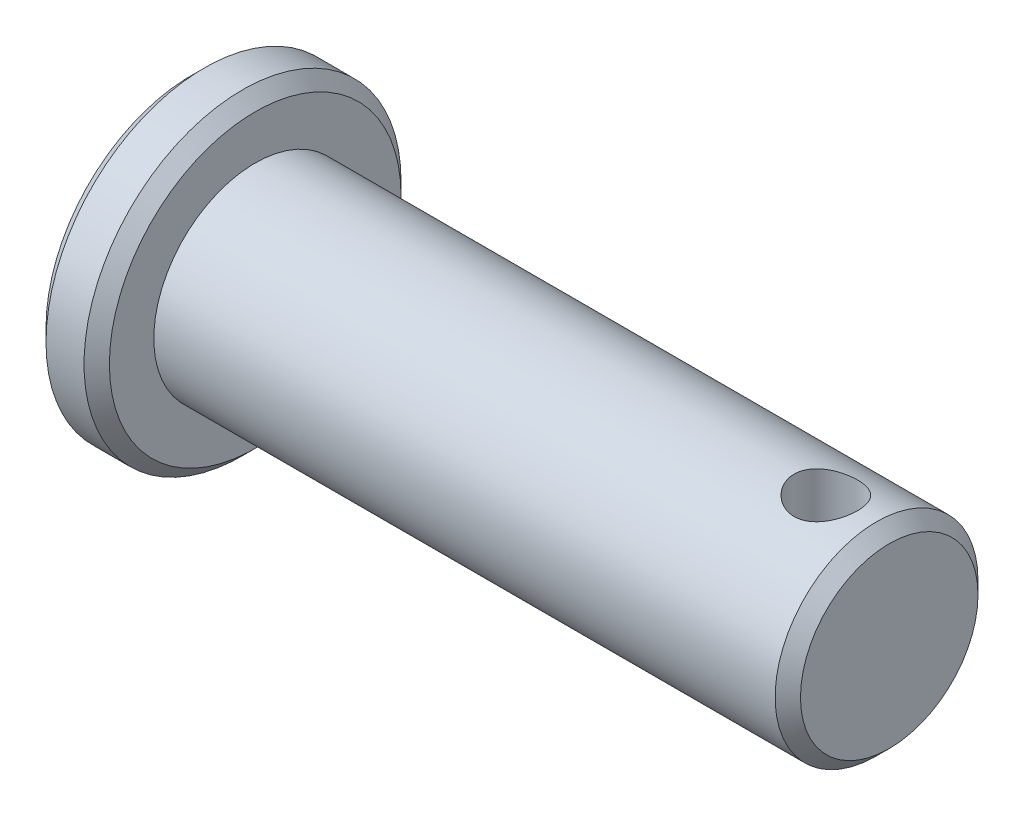
ISO-10303-21;
HEADER;
FILE_DESCRIPTION(('STEP AP214'),'2;1');
FILE_NAME('part.step','',(''),(''),'','','');
FILE_SCHEMA(('AUTOMOTIVE_DESIGN { 1 0 10303 214 1 1 1 1 }'));
ENDSEC;
DATA;
#1=APPLICATION_CONTEXT('core data for automotive mechanical design processes');
#2=APPLICATION_PROTOCOL_DEFINITION('international standard','automotive_design',2000,#1);
#3=PRODUCT_CONTEXT('',#1,'mechanical');
#4=PRODUCT('Part','Part','',(#3));
#5=PRODUCT_RELATED_PRODUCT_CATEGORY('part','',(#4));
#6=PRODUCT_DEFINITION_FORMATION('','',#4);
#7=PRODUCT_DEFINITION_CONTEXT('part definition',#1,'design');
#8=PRODUCT_DEFINITION('design','',#6,#7);
#9=PRODUCT_DEFINITION_SHAPE('','',#8);
#10=(LENGTH_UNIT() NAMED_UNIT(*) SI_UNIT(.MILLI.,.METRE.));
#11=(NAMED_UNIT(*) PLANE_ANGLE_UNIT() SI_UNIT($,.RADIAN.));
#12=(NAMED_UNIT(*) SI_UNIT($,.STERADIAN.) SOLID_ANGLE_UNIT());
#13=UNCERTAINTY_MEASURE_WITH_UNIT(LENGTH_MEASURE(1.E-05),#10,'distance_accuracy_value','');
#14=(GEOMETRIC_REPRESENTATION_CONTEXT(3) GLOBAL_UNCERTAINTY_ASSIGNED_CONTEXT((#13)) GLOBAL_UNIT_ASSIGNED_CONTEXT((#10,
#11,#12)) REPRESENTATION_CONTEXT('',''));
#15=CARTESIAN_POINT('',(0.,0.,0.));
#16=DIRECTION('',(0.,0.,1.));
#17=DIRECTION('',(1.,0.,0.));
#18=AXIS2_PLACEMENT_3D('',#15,#16,#17);
#19=CARTESIAN_POINT('',(-55.,0.,0.));
#20=DIRECTION('',(-1.,0.,0.));
#21=DIRECTION('',(0.,0.,1.));
#22=AXIS2_PLACEMENT_3D('',#19,#20,#21);
#23=PLANE('',#22);
#24=CARTESIAN_POINT('',(-55.,0.,0.));
#25=DIRECTION('',(-1.,0.,0.));
#26=DIRECTION('',(0.,0.,1.));
#27=AXIS2_PLACEMENT_3D('',#24,#25,#26);
#28=CIRCLE('',#27,11.5);
#29=CARTESIAN_POINT('',(-55.,0.,11.5));
#30=VERTEX_POINT('',#29);
#31=EDGE_CURVE('E50',#30,#30,#28,.T.);
#32=ORIENTED_EDGE('',*,*,#31,.T.);
#33=EDGE_LOOP('',(#32));
#34=FACE_BOUND('',#33,.T.);
#35=ADVANCED_FACE('F32',(#34),#23,.T.);
#36=CARTESIAN_POINT('',(0.,0.,0.));
#37=DIRECTION('',(1.,0.,0.));
#38=DIRECTION('',(0.,0.,-1.));
#39=AXIS2_PLACEMENT_3D('',#36,#37,#38);
#40=CYLINDRICAL_SURFACE('',#39,12.5);
#41=CARTESIAN_POINT('',(-51.,0.,0.));
#42=DIRECTION('',(1.,0.,0.));
#43=DIRECTION('',(0.,0.,-1.));
#44=AXIS2_PLACEMENT_3D('',#41,#42,#43);
#45=CIRCLE('',#44,12.5);
#46=CARTESIAN_POINT('',(-51.,0.,-12.5));
#47=VERTEX_POINT('',#46);
#48=EDGE_CURVE('E102',#47,#47,#45,.F.);
#49=ORIENTED_EDGE('',*,*,#48,.T.);
#50=EDGE_LOOP('',(#49));
#51=FACE_BOUND('',#50,.T.);
#52=CARTESIAN_POINT('',(-54.,0.,0.));
#53=DIRECTION('',(-1.,0.,0.));
#54=DIRECTION('',(0.,0.,1.));
#55=AXIS2_PLACEMENT_3D('',#52,#53,#54);
#56=CIRCLE('',#55,12.5);
#57=CARTESIAN_POINT('',(-54.,0.,12.5));
#58=VERTEX_POINT('',#57);
#59=EDGE_CURVE('E100',#58,#58,#56,.F.);
#60=ORIENTED_EDGE('',*,*,#59,.T.);
#61=EDGE_LOOP('',(#60));
#62=FACE_BOUND('',#61,.T.);
#63=ADVANCED_FACE('F81',(#51,#62),#40,.T.);
#64=CARTESIAN_POINT('',(-50.,12.5,0.));
#65=DIRECTION('',(1.,0.,0.));
#66=DIRECTION('',(0.,0.,-1.));
#67=AXIS2_PLACEMENT_3D('',#64,#65,#66);
#68=PLANE('',#67);
#69=CARTESIAN_POINT('',(-50.,0.,0.));
#70=DIRECTION('',(1.,0.,0.));
#71=DIRECTION('',(0.,0.,-1.));
#72=AXIS2_PLACEMENT_3D('',#69,#70,#71);
#73=CIRCLE('',#72,11.5);
#74=CARTESIAN_POINT('',(-50.,0.,-11.5));
#75=VERTEX_POINT('',#74);
#76=EDGE_CURVE('E103',#75,#75,#73,.T.);
#77=ORIENTED_EDGE('',*,*,#76,.T.);
#78=EDGE_LOOP('',(#77));
#79=FACE_BOUND('',#78,.T.);
#80=CARTESIAN_POINT('',(-50.,0.,0.));
#81=DIRECTION('',(1.,0.,0.));
#82=DIRECTION('',(0.,0.,-1.));
#83=AXIS2_PLACEMENT_3D('',#80,#81,#82);
#84=CIRCLE('',#83,7.99999999999999);
#85=CARTESIAN_POINT('',(-50.,0.,-7.99999999999999));
#86=VERTEX_POINT('',#85);
#87=EDGE_CURVE('E108',#86,#86,#84,.T.);
#88=ORIENTED_EDGE('',*,*,#87,.F.);
#89=EDGE_LOOP('',(#88));
#90=FACE_BOUND('',#89,.T.);
#91=ADVANCED_FACE('F78',(#79,#90),#68,.T.);
#92=CARTESIAN_POINT('',(0.,0.,0.));
#93=DIRECTION('',(1.,0.,0.));
#94=DIRECTION('',(0.,0.,-1.));
#95=AXIS2_PLACEMENT_3D('',#92,#93,#94);
#96=CYLINDRICAL_SURFACE('',#95,7.99999999999999);
#97=CARTESIAN_POINT('',(-5.,-7.59934207678532,2.5));
#98=CARTESIAN_POINT('',(-5.13669407221868,-7.59934291923871,2.49999907560094));
#99=CARTESIAN_POINT('',(-5.2733975374064,-7.60307063010084,2.48875077582989));
#100=CARTESIAN_POINT('',(-5.54278832175562,-7.61751277997753,2.44418350802654));
#101=CARTESIAN_POINT('',(-5.67547454546433,-7.62822910706271,2.4108585756503));
#102=CARTESIAN_POINT('',(-5.932889803864,-7.65531877671918,2.32339576447118));
#103=CARTESIAN_POINT('',(-6.05763246621136,-7.67168210388632,2.26929471473354));
#104=CARTESIAN_POINT('',(-6.29630539172803,-7.70820812437376,2.14193828346314));
#105=CARTESIAN_POINT('',(-6.41023373992025,-7.7283714887168,2.06867951811264));
#106=CARTESIAN_POINT('',(-6.62795773498698,-7.77100255337239,1.90239214124459));
#107=CARTESIAN_POINT('',(-6.73132721887198,-7.79352246769559,1.8088187994408));
#108=CARTESIAN_POINT('',(-6.92119202641838,-7.8378849172067,1.60572409291099));
#109=CARTESIAN_POINT('',(-7.0076849938897,-7.85972735745254,1.49620050503713));
#110=CARTESIAN_POINT('',(-7.16322212602249,-7.90087106780156,1.26125182498672));
#111=CARTESIAN_POINT('',(-7.23182740766292,-7.92010369125559,1.13552311304019));
#112=CARTESIAN_POINT('',(-7.3467520997111,-7.95325103666036,0.873608465706807));
#113=CARTESIAN_POINT('',(-7.39307674829918,-7.96716700839838,0.737424996974103));
#114=CARTESIAN_POINT('',(-7.46070225619414,-7.98774351641723,0.462928713932196));
#115=CARTESIAN_POINT('',(-7.48273149957571,-7.99461477968282,0.324811430936432));
#116=CARTESIAN_POINT('',(-7.50344869287505,-8.00107191752032,0.0466816279690388));
#117=CARTESIAN_POINT('',(-7.50214194871765,-8.0006594482014,-0.093330453946173));
#118=CARTESIAN_POINT('',(-7.47670341682812,-7.99274232265062,-0.366148960709463));
#119=CARTESIAN_POINT('',(-7.453361232974,-7.98548301944273,-0.499037268628066));
#120=CARTESIAN_POINT('',(-7.38581001991397,-7.96498965121749,-0.758906126695562));
#121=CARTESIAN_POINT('',(-7.34159962982675,-7.95175519654418,-0.885886290962472));
#122=CARTESIAN_POINT('',(-7.23305962185038,-7.92046919458912,-1.13215620630948));
#123=CARTESIAN_POINT('',(-7.1684903828745,-7.9023606723334,-1.25133281124536));
#124=CARTESIAN_POINT('',(-7.02125780059033,-7.86323445907696,-1.47740502230437));
#125=CARTESIAN_POINT('',(-6.93858988172226,-7.84221603291308,-1.58429751241882));
#126=CARTESIAN_POINT('',(-6.75345273039958,-7.79847341467062,-1.78747539690657));
#127=CARTESIAN_POINT('',(-6.65030186232582,-7.77571463969685,-1.88313309818382));
#128=CARTESIAN_POINT('',(-6.42920979634287,-7.73181230889307,-2.05597948519529));
#129=CARTESIAN_POINT('',(-6.3112668588193,-7.71066894351395,-2.13316599552377));
#130=CARTESIAN_POINT('',(-6.06216506230486,-7.67221693265788,-2.26760930038169));
#131=CARTESIAN_POINT('',(-5.93087318201806,-7.65495380588193,-2.32463361399527));
#132=CARTESIAN_POINT('',(-5.65988101631599,-7.62675090557698,-2.41556691891091));
#133=CARTESIAN_POINT('',(-5.52018377161125,-7.61580886035022,-2.44948421530003));
#134=CARTESIAN_POINT('',(-5.24236009484572,-7.60199126814081,-2.4920297037281));
#135=CARTESIAN_POINT('',(-5.10439600752974,-7.59880932787511,-2.50161908707794));
#136=CARTESIAN_POINT('',(-4.82882051700973,-7.60002154919848,-2.49793488996242));
#137=CARTESIAN_POINT('',(-4.69120906260067,-7.60441454014632,-2.48466484222813));
#138=CARTESIAN_POINT('',(-4.42438340669516,-7.61997914967832,-2.43649747026382));
#139=CARTESIAN_POINT('',(-4.2950414518516,-7.63095108204021,-2.40223662321101));
#140=CARTESIAN_POINT('',(-4.04395641600833,-7.65822574662761,-2.31380747322029));
#141=CARTESIAN_POINT('',(-3.92221457815774,-7.67452934824622,-2.25963592342302));
#142=CARTESIAN_POINT('',(-3.68592178045639,-7.71121079306467,-2.13115021311757));
#143=CARTESIAN_POINT('',(-3.57167716881442,-7.73169206979508,-2.05630294977117));
#144=CARTESIAN_POINT('',(-3.3570193072762,-7.77420697945614,-1.8892128173596));
#145=CARTESIAN_POINT('',(-3.25660966214934,-7.79624101471393,-1.79696542938156));
#146=CARTESIAN_POINT('',(-3.06817926817436,-7.8404837512537,-1.59314589550721));
#147=CARTESIAN_POINT('',(-2.98084442772027,-7.86266184571361,-1.48093129957704));
#148=CARTESIAN_POINT('',(-2.82621791335749,-7.90378119687352,-1.24290309130279));
#149=CARTESIAN_POINT('',(-2.75892532137793,-7.9227226018189,-1.11709010221724));
#150=CARTESIAN_POINT('',(-2.64693887505664,-7.95512623857024,-0.856211046663662));
#151=CARTESIAN_POINT('',(-2.60208142431264,-7.96862799122399,-0.72122036856751));
#152=CARTESIAN_POINT('',(-2.53585492282059,-7.98880485297151,-0.445114508112778));
#153=CARTESIAN_POINT('',(-2.51447852183301,-7.99548209828554,-0.304001256680712));
#154=CARTESIAN_POINT('',(-2.49641799650076,-8.00111606808922,-0.0259698732977972));
#155=CARTESIAN_POINT('',(-2.49874309965849,-8.00038258814778,0.110878383893045));
#156=CARTESIAN_POINT('',(-2.5256236220974,-7.99201956162096,0.382146443846496));
#157=CARTESIAN_POINT('',(-2.5501775919839,-7.98439046465237,0.516566404359137));
#158=CARTESIAN_POINT('',(-2.62018801844456,-7.9631914168959,0.777510236961583));
#159=CARTESIAN_POINT('',(-2.66537921569075,-7.94969695920409,0.904111836898962));
#160=CARTESIAN_POINT('',(-2.77514165441696,-7.91815891175899,1.14799685100018));
#161=CARTESIAN_POINT('',(-2.83971621994686,-7.90011454182715,1.26527866254896));
#162=CARTESIAN_POINT('',(-2.98894551668888,-7.86059793766751,1.49152338993938));
#163=CARTESIAN_POINT('',(-3.07420704492795,-7.83903019501923,1.60006921410622));
#164=CARTESIAN_POINT('',(-3.26131977888693,-7.7951747309412,1.80164158279864));
#165=CARTESIAN_POINT('',(-3.36317594827878,-7.77288679569652,1.89466346700832));
#166=CARTESIAN_POINT('',(-3.5846314396822,-7.72923785154875,2.06565731822505));
#167=CARTESIAN_POINT('',(-3.70470680623315,-7.70793201726911,2.14302855989422));
#168=CARTESIAN_POINT('',(-3.95679624053829,-7.66960250559061,2.27640941497043));
#169=CARTESIAN_POINT('',(-4.08880545290051,-7.65257709722772,2.33242766807092));
#170=CARTESIAN_POINT('',(-4.34944523462935,-7.62613120880654,2.41742360871585));
#171=CARTESIAN_POINT('',(-4.47740509490314,-7.61618630087497,2.44829879675747));
#172=CARTESIAN_POINT('',(-4.73690766419299,-7.60279212964796,2.48958491632199));
#173=CARTESIAN_POINT('',(-4.868449482403,-7.59934126603195,2.50000088961557));
#174=CARTESIAN_POINT('',(-5.,-7.59934207678532,2.5));
#175=B_SPLINE_CURVE_WITH_KNOTS('',3,(#97,#98,#99,#100,#101,#102,#103,#104,#105,#106,#107,#108,
#109,#110,#111,#112,#113,#114,#115,#116,#117,#118,#119,#120,#121,#122,#123,#124,#125,#126,#127,
#128,#129,#130,#131,#132,#133,#134,#135,#136,#137,#138,#139,#140,#141,#142,#143,#144,#145,#146,
#147,#148,#149,#150,#151,#152,#153,#154,#155,#156,#157,#158,#159,#160,#161,#162,#163,#164,#165,
#166,#167,#168,#169,#170,#171,#172,#173,#174),.UNSPECIFIED.,.T.,.F.,(4,2,2,2,2,2,2,2,2,2,2,2,2,
2,2,2,2,2,2,2,2,2,2,2,2,2,2,2,2,2,2,2,2,2,2,2,2,2,4),(0.,0.40959627509698,0.819303254119471,
1.22828728823716,1.6373436098499,2.05914161101677,2.48099845882245,2.91239643927466,
3.34369294835844,3.76167445671067,4.17956092943549,4.58301965939501,4.98650470380186,
5.39492809216818,5.80345485426375,6.22900677874668,6.65460879707552,7.08496941871144,
7.5151752791037,7.92809866580735,8.34095824443043,8.7418794409359,9.14286604511284,
9.55535226624085,9.96794576028624,10.3976387562789,10.8273120663904,11.2538047858686,
11.6801639628603,12.0887760488391,12.4973614938948,12.9008369303438,13.3043815982817,
13.7216138621529,14.1389711554925,14.5701559100827,15.0011660161251,15.3954470874764,
15.7896309838242),.UNSPECIFIED.);
#176=CARTESIAN_POINT('',(-5.,-7.59934207678532,2.5));
#177=VERTEX_POINT('',#176);
#178=EDGE_CURVE('E36',#177,#177,#175,.T.);
#179=ORIENTED_EDGE('',*,*,#178,.F.);
#180=EDGE_LOOP('',(#179));
#181=FACE_BOUND('',#180,.T.);
#182=CARTESIAN_POINT('',(-5.,7.59934207678532,2.5));
#183=CARTESIAN_POINT('',(-4.86330592778133,7.59934291923871,2.49999907560094));
#184=CARTESIAN_POINT('',(-4.7266024625936,7.60307063010084,2.48875077582989));
#185=CARTESIAN_POINT('',(-4.45721167824439,7.61751277997753,2.44418350802654));
#186=CARTESIAN_POINT('',(-4.32452545453568,7.62822910706271,2.4108585756503));
#187=CARTESIAN_POINT('',(-4.067110196136,7.65531877671918,2.32339576447118));
#188=CARTESIAN_POINT('',(-3.94236753378864,7.67168210388632,2.26929471473354));
#189=CARTESIAN_POINT('',(-3.70369460827198,7.70820812437376,2.14193828346314));
#190=CARTESIAN_POINT('',(-3.58976626007976,7.7283714887168,2.06867951811264));
#191=CARTESIAN_POINT('',(-3.37204226501303,7.77100255337239,1.90239214124459));
#192=CARTESIAN_POINT('',(-3.26867278112803,7.79352246769559,1.8088187994408));
#193=CARTESIAN_POINT('',(-3.07880797358163,7.8378849172067,1.60572409291099));
#194=CARTESIAN_POINT('',(-2.99231500611031,7.85972735745254,1.49620050503713));
#195=CARTESIAN_POINT('',(-2.83677787397751,7.90087106780156,1.26125182498672));
#196=CARTESIAN_POINT('',(-2.76817259233709,7.92010369125559,1.13552311304019));
#197=CARTESIAN_POINT('',(-2.65324790028891,7.95325103666036,0.873608465706807));
#198=CARTESIAN_POINT('',(-2.60692325170083,7.96716700839838,0.737424996974103));
#199=CARTESIAN_POINT('',(-2.53929774380587,7.98774351641723,0.462928713932196));
#200=CARTESIAN_POINT('',(-2.5172685004243,7.99461477968282,0.324811430936432));
#201=CARTESIAN_POINT('',(-2.49655130712496,8.00107191752032,0.0466816279690392));
#202=CARTESIAN_POINT('',(-2.49785805128236,8.0006594482014,-0.0933304539461725));
#203=CARTESIAN_POINT('',(-2.52329658317188,7.99274232265062,-0.366148960709463));
#204=CARTESIAN_POINT('',(-2.54663876702601,7.98548301944273,-0.499037268628065));
#205=CARTESIAN_POINT('',(-2.61418998008604,7.96498965121749,-0.758906126695561));
#206=CARTESIAN_POINT('',(-2.65840037017326,7.95175519654418,-0.885886290962471));
#207=CARTESIAN_POINT('',(-2.76694037814963,7.92046919458912,-1.13215620630948));
#208=CARTESIAN_POINT('',(-2.83150961712551,7.9023606723334,-1.25133281124536));
#209=CARTESIAN_POINT('',(-2.97874219940968,7.86323445907696,-1.47740502230436));
#210=CARTESIAN_POINT('',(-3.06141011827775,7.84221603291308,-1.58429751241882));
#211=CARTESIAN_POINT('',(-3.24654726960043,7.79847341467062,-1.78747539690657));
#212=CARTESIAN_POINT('',(-3.34969813767419,7.77571463969685,-1.88313309818382));
#213=CARTESIAN_POINT('',(-3.57079020365714,7.73181230889307,-2.05597948519529));
#214=CARTESIAN_POINT('',(-3.68873314118071,7.71066894351395,-2.13316599552377));
#215=CARTESIAN_POINT('',(-3.93783493769515,7.67221693265788,-2.26760930038169));
#216=CARTESIAN_POINT('',(-4.06912681798195,7.65495380588193,-2.32463361399527));
#217=CARTESIAN_POINT('',(-4.34011898368402,7.62675090557698,-2.41556691891091));
#218=CARTESIAN_POINT('',(-4.47981622838875,7.61580886035022,-2.44948421530003));
#219=CARTESIAN_POINT('',(-4.75763990515428,7.60199126814081,-2.4920297037281));
#220=CARTESIAN_POINT('',(-4.89560399247027,7.59880932787511,-2.50161908707794));
#221=CARTESIAN_POINT('',(-5.17117948299028,7.60002154919848,-2.49793488996242));
#222=CARTESIAN_POINT('',(-5.30879093739934,7.60441454014632,-2.48466484222813));
#223=CARTESIAN_POINT('',(-5.57561659330485,7.61997914967832,-2.43649747026382));
#224=CARTESIAN_POINT('',(-5.70495854814841,7.63095108204021,-2.40223662321101));
#225=CARTESIAN_POINT('',(-5.95604358399167,7.65822574662761,-2.31380747322029));
#226=CARTESIAN_POINT('',(-6.07778542184227,7.67452934824622,-2.25963592342302));
#227=CARTESIAN_POINT('',(-6.31407821954362,7.71121079306467,-2.13115021311757));
#228=CARTESIAN_POINT('',(-6.42832283118559,7.73169206979507,-2.05630294977117));
#229=CARTESIAN_POINT('',(-6.64298069272381,7.77420697945614,-1.8892128173596));
#230=CARTESIAN_POINT('',(-6.74339033785067,7.79624101471393,-1.79696542938156));
#231=CARTESIAN_POINT('',(-6.93182073182564,7.8404837512537,-1.59314589550722));
#232=CARTESIAN_POINT('',(-7.01915557227974,7.86266184571361,-1.48093129957704));
#233=CARTESIAN_POINT('',(-7.17378208664251,7.90378119687352,-1.24290309130279));
#234=CARTESIAN_POINT('',(-7.24107467862208,7.9227226018189,-1.11709010221725));
#235=CARTESIAN_POINT('',(-7.35306112494337,7.95512623857024,-0.856211046663664));
#236=CARTESIAN_POINT('',(-7.39791857568737,7.96862799122399,-0.721220368567513));
#237=CARTESIAN_POINT('',(-7.46414507717942,7.98880485297151,-0.44511450811278));
#238=CARTESIAN_POINT('',(-7.485521478167,7.99548209828554,-0.304001256680715));
#239=CARTESIAN_POINT('',(-7.50358200349925,8.00111606808922,-0.0259698732977999));
#240=CARTESIAN_POINT('',(-7.50125690034152,8.00038258814778,0.110878383893043));
#241=CARTESIAN_POINT('',(-7.47437637790261,7.99201956162096,0.382146443846494));
#242=CARTESIAN_POINT('',(-7.44982240801611,7.98439046465237,0.516566404359135));
#243=CARTESIAN_POINT('',(-7.37981198155545,7.9631914168959,0.777510236961581));
#244=CARTESIAN_POINT('',(-7.33462078430926,7.94969695920409,0.90411183689896));
#245=CARTESIAN_POINT('',(-7.22485834558305,7.91815891175899,1.14799685100018));
#246=CARTESIAN_POINT('',(-7.16028378005315,7.90011454182715,1.26527866254896));
#247=CARTESIAN_POINT('',(-7.01105448331113,7.86059793766751,1.49152338993938));
#248=CARTESIAN_POINT('',(-6.92579295507206,7.83903019501923,1.60006921410622));
#249=CARTESIAN_POINT('',(-6.73868022111308,7.79517473094121,1.80164158279864));
#250=CARTESIAN_POINT('',(-6.63682405172123,7.77288679569652,1.89466346700832));
#251=CARTESIAN_POINT('',(-6.41536856031781,7.72923785154875,2.06565731822505));
#252=CARTESIAN_POINT('',(-6.29529319376686,7.70793201726911,2.14302855989422));
#253=CARTESIAN_POINT('',(-6.04320375946172,7.66960250559061,2.27640941497043));
#254=CARTESIAN_POINT('',(-5.9111945470995,7.65257709722772,2.33242766807092));
#255=CARTESIAN_POINT('',(-5.65055476537067,7.62613120880654,2.41742360871585));
#256=CARTESIAN_POINT('',(-5.52259490509688,7.61618630087497,2.44829879675747));
#257=CARTESIAN_POINT('',(-5.26309233580703,7.60279212964796,2.48958491632199));
#258=CARTESIAN_POINT('',(-5.13155051759701,7.59934126603195,2.50000088961557));
#259=CARTESIAN_POINT('',(-5.,7.59934207678532,2.5));
#260=B_SPLINE_CURVE_WITH_KNOTS('',3,(#182,#183,#184,#185,#186,#187,#188,#189,#190,#191,#192,
#193,#194,#195,#196,#197,#198,#199,#200,#201,#202,#203,#204,#205,#206,#207,#208,#209,#210,#211,
#212,#213,#214,#215,#216,#217,#218,#219,#220,#221,#222,#223,#224,#225,#226,#227,#228,#229,#230,
#231,#232,#233,#234,#235,#236,#237,#238,#239,#240,#241,#242,#243,#244,#245,#246,#247,#248,#249,
#250,#251,#252,#253,#254,#255,#256,#257,#258,#259),.UNSPECIFIED.,.T.,.F.,(4,2,2,2,2,2,2,2,2,2,2,
2,2,2,2,2,2,2,2,2,2,2,2,2,2,2,2,2,2,2,2,2,2,2,2,2,2,2,4),(0.,0.409596275096981,
0.819303254119472,1.22828728823716,1.6373436098499,2.05914161101677,2.48099845882245,
2.91239643927466,3.34369294835844,3.76167445671067,4.17956092943549,4.58301965939501,
4.98650470380186,5.39492809216818,5.80345485426375,6.22900677874668,6.65460879707552,
7.08496941871144,7.51517527910369,7.92809866580735,8.34095824443042,8.7418794409359,
9.14286604511284,9.55535226624085,9.96794576028624,10.3976387562789,10.8273120663904,
11.2538047858686,11.6801639628603,12.0887760488391,12.4973614938948,12.9008369303438,
13.3043815982817,13.7216138621529,14.1389711554924,14.5701559100827,15.0011660161251,
15.3954470874764,15.7896309838242),.UNSPECIFIED.);
#261=CARTESIAN_POINT('',(-5.,7.59934207678532,2.5));
#262=VERTEX_POINT('',#261);
#263=EDGE_CURVE('E53',#262,#262,#260,.T.);
#264=ORIENTED_EDGE('',*,*,#263,.F.);
#265=EDGE_LOOP('',(#264));
#266=FACE_BOUND('',#265,.T.);
#267=CARTESIAN_POINT('',(-1.,0.,0.));
#268=DIRECTION('',(1.,0.,0.));
#269=DIRECTION('',(0.,0.,-1.));
#270=AXIS2_PLACEMENT_3D('',#267,#268,#269);
#271=CIRCLE('',#270,7.99999999999999);
#272=CARTESIAN_POINT('',(-1.,0.,-7.99999999999999));
#273=VERTEX_POINT('',#272);
#274=EDGE_CURVE('E10',#273,#273,#271,.F.);
#275=ORIENTED_EDGE('',*,*,#274,.T.);
#276=EDGE_LOOP('',(#275));
#277=FACE_BOUND('',#276,.T.);
#278=ORIENTED_EDGE('',*,*,#87,.T.);
#279=EDGE_LOOP('',(#278));
#280=FACE_BOUND('',#279,.T.);
#281=ADVANCED_FACE('F58',(#181,#266,#277,#280),#96,.T.);
#282=CARTESIAN_POINT('',(0.,7.99999999999999,0.));
#283=DIRECTION('',(1.,0.,0.));
#284=DIRECTION('',(0.,0.,-1.));
#285=AXIS2_PLACEMENT_3D('',#282,#283,#284);
#286=PLANE('',#285);
#287=CARTESIAN_POINT('',(0.,0.,0.));
#288=DIRECTION('',(1.,0.,0.));
#289=DIRECTION('',(0.,0.,-1.));
#290=AXIS2_PLACEMENT_3D('',#287,#288,#289);
#291=CIRCLE('',#290,6.99999999999999);
#292=CARTESIAN_POINT('',(0.,0.,-6.99999999999999));
#293=VERTEX_POINT('',#292);
#294=EDGE_CURVE('E45',#293,#293,#291,.T.);
#295=ORIENTED_EDGE('',*,*,#294,.T.);
#296=EDGE_LOOP('',(#295));
#297=FACE_BOUND('',#296,.T.);
#298=ADVANCED_FACE('F66',(#297),#286,.T.);
#299=CARTESIAN_POINT('',(-50.,0.,0.));
#300=DIRECTION('',(-1.,0.,0.));
#301=DIRECTION('',(0.,0.,1.));
#302=AXIS2_PLACEMENT_3D('',#299,#300,#301);
#303=CONICAL_SURFACE('',#302,11.5,0.785398163397446);
#304=ORIENTED_EDGE('',*,*,#48,.F.);
#305=EDGE_LOOP('',(#304));
#306=FACE_BOUND('',#305,.T.);
#307=ORIENTED_EDGE('',*,*,#76,.F.);
#308=EDGE_LOOP('',(#307));
#309=FACE_BOUND('',#308,.T.);
#310=ADVANCED_FACE('F69',(#306,#309),#303,.T.);
#311=CARTESIAN_POINT('',(-54.,0.,0.));
#312=DIRECTION('',(1.,0.,0.));
#313=DIRECTION('',(0.,0.,-1.));
#314=AXIS2_PLACEMENT_3D('',#311,#312,#313);
#315=CONICAL_SURFACE('',#314,12.5,0.785398163397453);
#316=ORIENTED_EDGE('',*,*,#31,.F.);
#317=EDGE_LOOP('',(#316));
#318=FACE_BOUND('',#317,.T.);
#319=ORIENTED_EDGE('',*,*,#59,.F.);
#320=EDGE_LOOP('',(#319));
#321=FACE_BOUND('',#320,.T.);
#322=ADVANCED_FACE('F75',(#318,#321),#315,.T.);
#323=CARTESIAN_POINT('',(0.,0.,0.));
#324=DIRECTION('',(-1.,0.,0.));
#325=DIRECTION('',(0.,0.,1.));
#326=AXIS2_PLACEMENT_3D('',#323,#324,#325);
#327=CONICAL_SURFACE('',#326,6.99999999999999,0.785398163397445);
#328=ORIENTED_EDGE('',*,*,#274,.F.);
#329=EDGE_LOOP('',(#328));
#330=FACE_BOUND('',#329,.T.);
#331=ORIENTED_EDGE('',*,*,#294,.F.);
#332=EDGE_LOOP('',(#331));
#333=FACE_BOUND('',#332,.T.);
#334=ADVANCED_FACE('F34',(#330,#333),#327,.T.);
#335=CARTESIAN_POINT('',(-5.,-40.,0.));
#336=DIRECTION('',(0.,1.,0.));
#337=DIRECTION('',(0.,0.,1.));
#338=AXIS2_PLACEMENT_3D('',#335,#336,#337);
#339=CYLINDRICAL_SURFACE('',#338,2.5);
#340=ORIENTED_EDGE('',*,*,#178,.T.);
#341=EDGE_LOOP('',(#340));
#342=FACE_BOUND('',#341,.T.);
#343=ORIENTED_EDGE('',*,*,#263,.T.);
#344=EDGE_LOOP('',(#343));
#345=FACE_BOUND('',#344,.T.);
#346=ADVANCED_FACE('F62',(#342,#345),#339,.F.);
#347=CLOSED_SHELL('',(#35,#63,#91,#281,#298,#310,#322,#334,#346));
#348=MANIFOLD_SOLID_BREP('B2',#347);
#349=ADVANCED_BREP_SHAPE_REPRESENTATION('',(#18,#348),#14);
#350=SHAPE_DEFINITION_REPRESENTATION(#9,#349);
ENDSEC;
END-ISO-10303-21;
